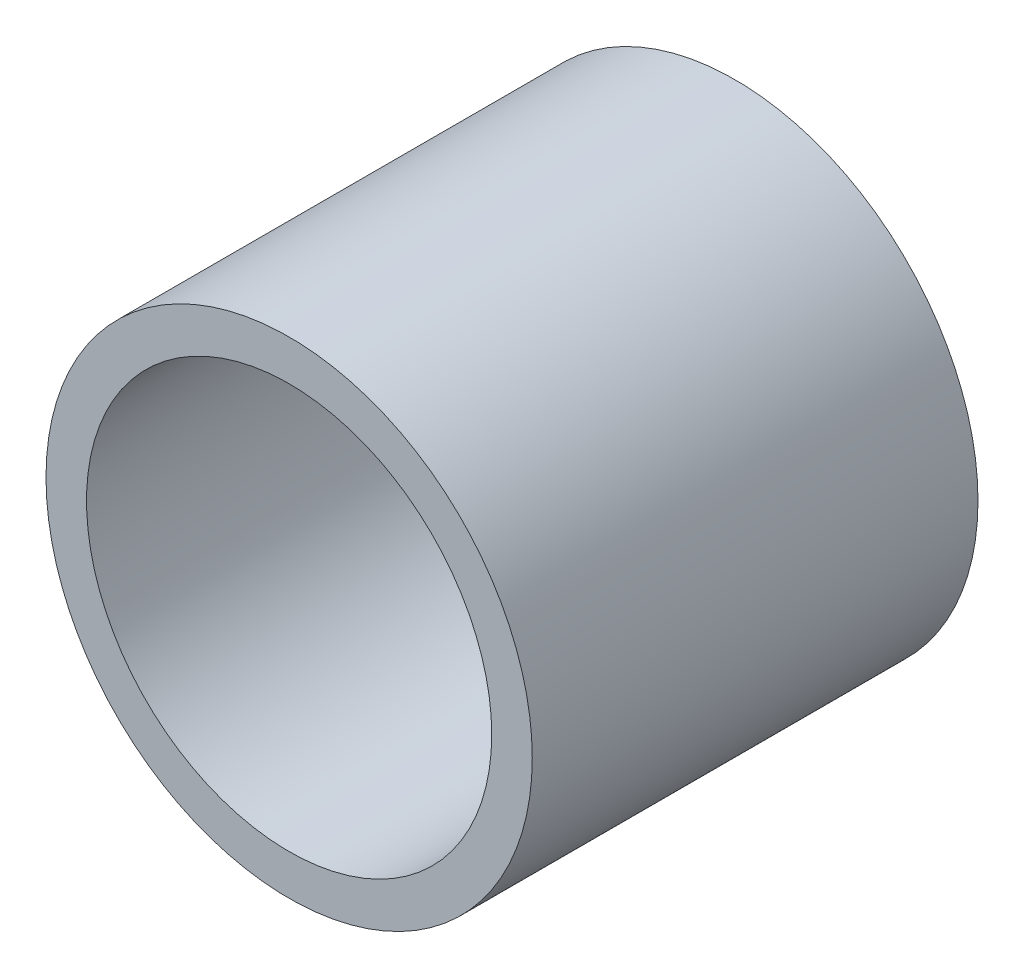
ISO-10303-21;
HEADER;
FILE_DESCRIPTION(('STEP AP214'),'2;1');
FILE_NAME('part.step','',(''),(''),'','','');
FILE_SCHEMA(('AUTOMOTIVE_DESIGN { 1 0 10303 214 1 1 1 1 }'));
ENDSEC;
DATA;
#1=APPLICATION_CONTEXT('core data for automotive mechanical design processes');
#2=APPLICATION_PROTOCOL_DEFINITION('international standard','automotive_design',2000,#1);
#3=PRODUCT_CONTEXT('',#1,'mechanical');
#4=PRODUCT('Part','Part','',(#3));
#5=PRODUCT_RELATED_PRODUCT_CATEGORY('part','',(#4));
#6=PRODUCT_DEFINITION_FORMATION('','',#4);
#7=PRODUCT_DEFINITION_CONTEXT('part definition',#1,'design');
#8=PRODUCT_DEFINITION('design','',#6,#7);
#9=PRODUCT_DEFINITION_SHAPE('','',#8);
#10=(LENGTH_UNIT() NAMED_UNIT(*) SI_UNIT(.MILLI.,.METRE.));
#11=(NAMED_UNIT(*) PLANE_ANGLE_UNIT() SI_UNIT($,.RADIAN.));
#12=(NAMED_UNIT(*) SI_UNIT($,.STERADIAN.) SOLID_ANGLE_UNIT());
#13=UNCERTAINTY_MEASURE_WITH_UNIT(LENGTH_MEASURE(1.E-05),#10,'distance_accuracy_value','');
#14=(GEOMETRIC_REPRESENTATION_CONTEXT(3) GLOBAL_UNCERTAINTY_ASSIGNED_CONTEXT((#13)) GLOBAL_UNIT_ASSIGNED_CONTEXT((#10,
#11,#12)) REPRESENTATION_CONTEXT('',''));
#15=CARTESIAN_POINT('',(0.,0.,0.));
#16=DIRECTION('',(0.,0.,1.));
#17=DIRECTION('',(1.,0.,0.));
#18=AXIS2_PLACEMENT_3D('',#15,#16,#17);
#19=CARTESIAN_POINT('',(0.,0.,11.));
#20=DIRECTION('',(0.,0.,1.));
#21=DIRECTION('',(1.,0.,0.));
#22=AXIS2_PLACEMENT_3D('',#19,#20,#21);
#23=PLANE('',#22);
#24=CARTESIAN_POINT('',(0.,0.,11.));
#25=DIRECTION('',(0.,0.,1.));
#26=DIRECTION('',(1.,0.,0.));
#27=AXIS2_PLACEMENT_3D('',#24,#25,#26);
#28=CIRCLE('',#27,6.);
#29=CARTESIAN_POINT('',(6.,0.,11.));
#30=VERTEX_POINT('',#29);
#31=EDGE_CURVE('E11',#30,#30,#28,.T.);
#32=ORIENTED_EDGE('',*,*,#31,.T.);
#33=EDGE_LOOP('',(#32));
#34=FACE_BOUND('',#33,.T.);
#35=CARTESIAN_POINT('',(0.,0.,11.));
#36=DIRECTION('',(0.,0.,1.));
#37=DIRECTION('',(1.,0.,0.));
#38=AXIS2_PLACEMENT_3D('',#35,#36,#37);
#39=CIRCLE('',#38,5.);
#40=CARTESIAN_POINT('',(5.,0.,11.));
#41=VERTEX_POINT('',#40);
#42=EDGE_CURVE('E54',#41,#41,#39,.T.);
#43=ORIENTED_EDGE('',*,*,#42,.F.);
#44=EDGE_LOOP('',(#43));
#45=FACE_BOUND('',#44,.T.);
#46=ADVANCED_FACE('F43',(#34,#45),#23,.T.);
#47=CARTESIAN_POINT('',(0.,0.,0.));
#48=DIRECTION('',(0.,0.,1.));
#49=DIRECTION('',(1.,0.,0.));
#50=AXIS2_PLACEMENT_3D('',#47,#48,#49);
#51=PLANE('',#50);
#52=CARTESIAN_POINT('',(0.,0.,0.));
#53=DIRECTION('',(0.,0.,1.));
#54=DIRECTION('',(1.,0.,0.));
#55=AXIS2_PLACEMENT_3D('',#52,#53,#54);
#56=CIRCLE('',#55,6.);
#57=CARTESIAN_POINT('',(6.,0.,0.));
#58=VERTEX_POINT('',#57);
#59=EDGE_CURVE('E47',#58,#58,#56,.T.);
#60=ORIENTED_EDGE('',*,*,#59,.F.);
#61=EDGE_LOOP('',(#60));
#62=FACE_BOUND('',#61,.T.);
#63=CARTESIAN_POINT('',(0.,0.,0.));
#64=DIRECTION('',(0.,0.,1.));
#65=DIRECTION('',(1.,0.,0.));
#66=AXIS2_PLACEMENT_3D('',#63,#64,#65);
#67=CIRCLE('',#66,5.);
#68=CARTESIAN_POINT('',(5.,0.,0.));
#69=VERTEX_POINT('',#68);
#70=EDGE_CURVE('E56',#69,#69,#67,.T.);
#71=ORIENTED_EDGE('',*,*,#70,.T.);
#72=EDGE_LOOP('',(#71));
#73=FACE_BOUND('',#72,.T.);
#74=ADVANCED_FACE('F66',(#62,#73),#51,.F.);
#75=CARTESIAN_POINT('',(0.,0.,11.));
#76=DIRECTION('',(0.,0.,-1.));
#77=DIRECTION('',(-1.,0.,0.));
#78=AXIS2_PLACEMENT_3D('',#75,#76,#77);
#79=CYLINDRICAL_SURFACE('',#78,6.);
#80=ORIENTED_EDGE('',*,*,#31,.F.);
#81=EDGE_LOOP('',(#80));
#82=FACE_BOUND('',#81,.T.);
#83=ORIENTED_EDGE('',*,*,#59,.T.);
#84=EDGE_LOOP('',(#83));
#85=FACE_BOUND('',#84,.T.);
#86=ADVANCED_FACE('F45',(#82,#85),#79,.T.);
#87=CARTESIAN_POINT('',(0.,0.,11.));
#88=DIRECTION('',(0.,0.,-1.));
#89=DIRECTION('',(-1.,0.,0.));
#90=AXIS2_PLACEMENT_3D('',#87,#88,#89);
#91=CYLINDRICAL_SURFACE('',#90,5.);
#92=ORIENTED_EDGE('',*,*,#42,.T.);
#93=EDGE_LOOP('',(#92));
#94=FACE_BOUND('',#93,.T.);
#95=ORIENTED_EDGE('',*,*,#70,.F.);
#96=EDGE_LOOP('',(#95));
#97=FACE_BOUND('',#96,.T.);
#98=ADVANCED_FACE('F62',(#94,#97),#91,.F.);
#99=CLOSED_SHELL('',(#46,#74,#86,#98));
#100=MANIFOLD_SOLID_BREP('B2',#99);
#101=ADVANCED_BREP_SHAPE_REPRESENTATION('',(#18,#100),#14);
#102=SHAPE_DEFINITION_REPRESENTATION(#9,#101);
ENDSEC;
END-ISO-10303-21;
